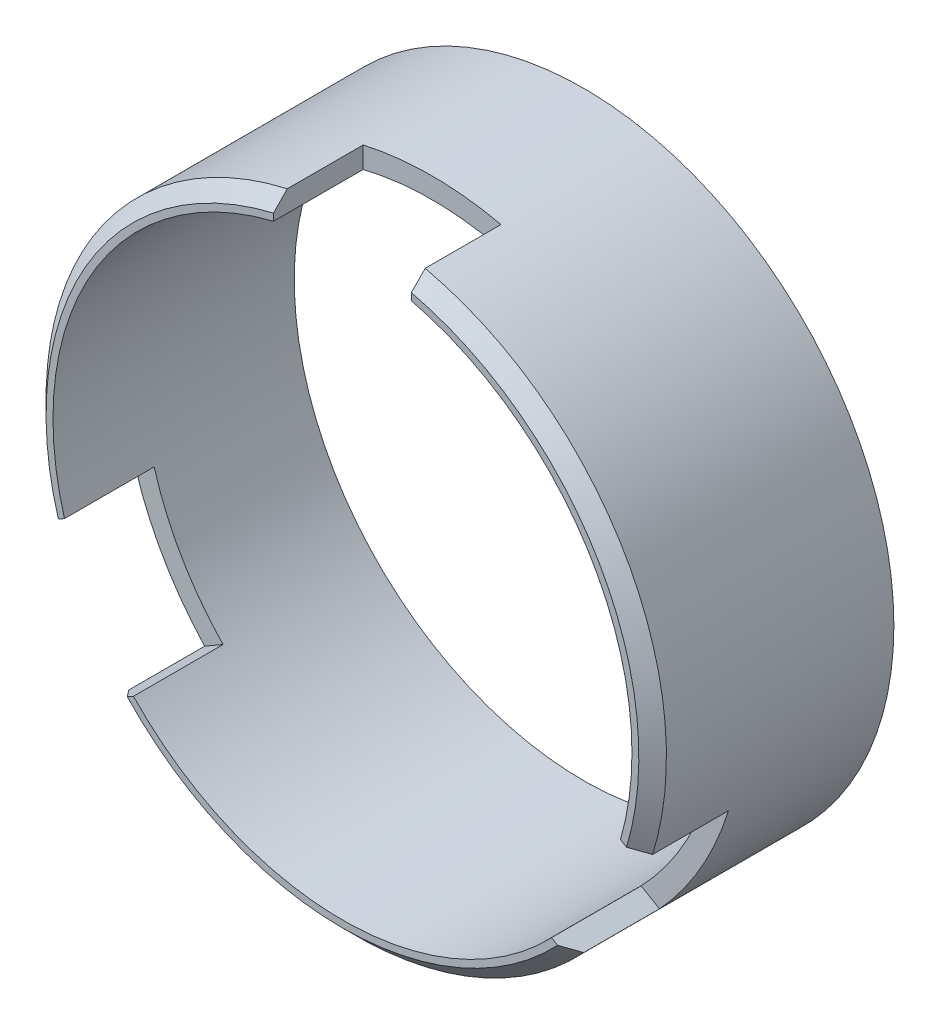
ISO-10303-21;
HEADER;
FILE_DESCRIPTION(('STEP AP214'),'2;1');
FILE_NAME('part.step','',(''),(''),'','','');
FILE_SCHEMA(('AUTOMOTIVE_DESIGN { 1 0 10303 214 1 1 1 1 }'));
ENDSEC;
DATA;
#1=APPLICATION_CONTEXT('core data for automotive mechanical design processes');
#2=APPLICATION_PROTOCOL_DEFINITION('international standard','automotive_design',2000,#1);
#3=PRODUCT_CONTEXT('',#1,'mechanical');
#4=PRODUCT('Part','Part','',(#3));
#5=PRODUCT_RELATED_PRODUCT_CATEGORY('part','',(#4));
#6=PRODUCT_DEFINITION_FORMATION('','',#4);
#7=PRODUCT_DEFINITION_CONTEXT('part definition',#1,'design');
#8=PRODUCT_DEFINITION('design','',#6,#7);
#9=PRODUCT_DEFINITION_SHAPE('','',#8);
#10=(LENGTH_UNIT() NAMED_UNIT(*) SI_UNIT(.MILLI.,.METRE.));
#11=(NAMED_UNIT(*) PLANE_ANGLE_UNIT() SI_UNIT($,.RADIAN.));
#12=(NAMED_UNIT(*) SI_UNIT($,.STERADIAN.) SOLID_ANGLE_UNIT());
#13=UNCERTAINTY_MEASURE_WITH_UNIT(LENGTH_MEASURE(1.E-05),#10,'distance_accuracy_value','');
#14=(GEOMETRIC_REPRESENTATION_CONTEXT(3) GLOBAL_UNCERTAINTY_ASSIGNED_CONTEXT((#13)) GLOBAL_UNIT_ASSIGNED_CONTEXT((#10,
#11,#12)) REPRESENTATION_CONTEXT('',''));
#15=CARTESIAN_POINT('',(0.,0.,0.));
#16=DIRECTION('',(0.,0.,1.));
#17=DIRECTION('',(1.,0.,0.));
#18=AXIS2_PLACEMENT_3D('',#15,#16,#17);
#19=CARTESIAN_POINT('',(0.,0.,17.5));
#20=DIRECTION('',(0.,0.,1.));
#21=DIRECTION('',(1.,0.,0.));
#22=AXIS2_PLACEMENT_3D('',#19,#20,#21);
#23=PLANE('',#22);
#24=DIRECTION('',(-0.866025403784444,0.499999999999992,0.));
#25=VECTOR('',#24,1.);
#26=CARTESIAN_POINT('',(23.2846096908266,-7.66987298107759,17.5));
#27=LINE('',#26,#25);
#28=CARTESIAN_POINT('',(20.6090447014745,-6.12513481424086,17.5));
#29=VERTEX_POINT('',#28);
#30=CARTESIAN_POINT('',(20.1635217326558,-5.8679120082632,17.5));
#31=VERTEX_POINT('',#30);
#32=EDGE_CURVE('E141',#29,#31,#27,.T.);
#33=ORIENTED_EDGE('',*,*,#32,.F.);
#34=CARTESIAN_POINT('',(0.,0.,17.5));
#35=DIRECTION('',(0.,0.,1.));
#36=DIRECTION('',(1.,0.,0.));
#37=AXIS2_PLACEMENT_3D('',#34,#35,#36);
#38=CIRCLE('',#37,21.5);
#39=CARTESIAN_POINT('',(4.99999999999999,20.9105236663265,17.5));
#40=VERTEX_POINT('',#39);
#41=EDGE_CURVE('E153',#29,#40,#38,.T.);
#42=ORIENTED_EDGE('',*,*,#41,.T.);
#43=DIRECTION('',(0.,1.,0.));
#44=VECTOR('',#43,1.);
#45=CARTESIAN_POINT('',(5.,19.,17.5));
#46=LINE('',#45,#44);
#47=CARTESIAN_POINT('',(5.,20.3960780543711,17.5));
#48=VERTEX_POINT('',#47);
#49=EDGE_CURVE('E338',#48,#40,#46,.T.);
#50=ORIENTED_EDGE('',*,*,#49,.F.);
#51=CARTESIAN_POINT('',(0.,0.,17.5));
#52=DIRECTION('',(0.,0.,1.));
#53=DIRECTION('',(1.,0.,0.));
#54=AXIS2_PLACEMENT_3D('',#51,#52,#53);
#55=CIRCLE('',#54,21.);
#56=EDGE_CURVE('E155',#31,#48,#55,.T.);
#57=ORIENTED_EDGE('',*,*,#56,.F.);
#58=EDGE_LOOP('',(#33,#42,#50,#57));
#59=FACE_BOUND('',#58,.T.);
#60=ADVANCED_FACE('F32',(#59),#23,.T.);
#61=CARTESIAN_POINT('',(0.,0.,17.5));
#62=DIRECTION('',(0.,0.,-1.));
#63=DIRECTION('',(-1.,0.,0.));
#64=AXIS2_PLACEMENT_3D('',#61,#62,#63);
#65=CONICAL_SURFACE('',#64,21.5,0.785398163397453);
#66=CARTESIAN_POINT('',(21.49853283888,-6.63868102981291,16.4998));
#67=CARTESIAN_POINT('',(21.3503445619276,-6.55312448822371,16.6666393707182));
#68=CARTESIAN_POINT('',(21.2021115715085,-6.46754213130241,16.8334257225624));
#69=CARTESIAN_POINT('',(20.90555616309,-6.29632578642235,17.1668923892295));
#70=CARTESIAN_POINT('',(20.7572337450903,-6.21069179846336,17.333572704052));
#71=CARTESIAN_POINT('',(20.6088666136233,-6.12503199517205,17.5002));
#72=B_SPLINE_CURVE_WITH_KNOTS('',3,(#66,#67,#68,#69,#70,#71),.UNSPECIFIED.,.F.,.F.,(4,2,4),(0.,
0.716962633500956,1.43392527012817),.UNSPECIFIED.);
#73=CARTESIAN_POINT('',(21.4983551919634,-6.63857846531777,16.5));
#74=VERTEX_POINT('',#73);
#75=EDGE_CURVE('E138',#74,#29,#72,.T.);
#76=ORIENTED_EDGE('',*,*,#75,.F.);
#77=CARTESIAN_POINT('',(0.,0.,16.5));
#78=DIRECTION('',(0.,0.,1.));
#79=DIRECTION('',(1.,0.,0.));
#80=AXIS2_PLACEMENT_3D('',#77,#78,#79);
#81=CIRCLE('',#80,22.5);
#82=CARTESIAN_POINT('',(5.,21.9374109684803,16.5));
#83=VERTEX_POINT('',#82);
#84=EDGE_CURVE('E176',#83,#74,#81,.F.);
#85=ORIENTED_EDGE('',*,*,#84,.F.);
#86=CARTESIAN_POINT('',(5.,18.689927542309,19.6528195455575));
#87=CARTESIAN_POINT('',(5.,19.1262544425193,19.2313016483825));
#88=CARTESIAN_POINT('',(5.,19.5621023441607,18.8092885722075));
#89=CARTESIAN_POINT('',(5.,20.4329823453068,17.9644237061282));
#90=CARTESIAN_POINT('',(5.,20.8680144469662,17.5415719184455));
#91=CARTESIAN_POINT('',(5.,21.7374069761219,16.6951794059946));
#92=CARTESIAN_POINT('',(5.,22.1717674041952,16.2716386818191));
#93=CARTESIAN_POINT('',(5.,23.0399184260285,15.4239712929834));
#94=CARTESIAN_POINT('',(5.,23.4737090182828,14.9998446267811));
#95=CARTESIAN_POINT('',(4.99999999999999,23.9072642802101,14.5754777863761));
#96=B_SPLINE_CURVE_WITH_KNOTS('',3,(#86,#87,#88,#89,#90,#91,#92,#93,#94,#95),.UNSPECIFIED.,.F.,
.F.,(4,2,2,2,4),(0.,1.82003371903964,3.64006262398424,5.46008996415568,7.28012210327091),.UNSPECIFIED.);
#97=EDGE_CURVE('E160',#40,#83,#96,.T.);
#98=ORIENTED_EDGE('',*,*,#97,.F.);
#99=ORIENTED_EDGE('',*,*,#41,.F.);
#100=EDGE_LOOP('',(#76,#85,#98,#99));
#101=FACE_BOUND('',#100,.T.);
#102=ADVANCED_FACE('F159',(#101),#65,.T.);
#103=DIRECTION('',(0.866025403784444,-0.499999999999992,0.));
#104=VECTOR('',#103,1.);
#105=CARTESIAN_POINT('',(13.9544826719044,-13.8301270189221,17.5));
#106=LINE('',#105,#104);
#107=CARTESIAN_POINT('',(15.1635217326558,-14.5281660461076,17.5));
#108=VERTEX_POINT('',#107);
#109=CARTESIAN_POINT('',(15.6090447014746,-14.7853888520853,17.5));
#110=VERTEX_POINT('',#109);
#111=EDGE_CURVE('E156',#108,#110,#106,.T.);
#112=ORIENTED_EDGE('',*,*,#111,.F.);
#113=CARTESIAN_POINT('',(-15.1635217326556,-14.5281660461078,17.5));
#114=VERTEX_POINT('',#113);
#115=EDGE_CURVE('E247',#114,#108,#55,.T.);
#116=ORIENTED_EDGE('',*,*,#115,.F.);
#117=DIRECTION('',(0.866025403784436,0.500000000000004,0.));
#118=VECTOR('',#117,1.);
#119=CARTESIAN_POINT('',(-18.2846096908264,-16.3301270189223,17.5));
#120=LINE('',#119,#118);
#121=CARTESIAN_POINT('',(-15.6090447014744,-14.7853888520855,17.5));
#122=VERTEX_POINT('',#121);
#123=EDGE_CURVE('E148',#122,#114,#120,.T.);
#124=ORIENTED_EDGE('',*,*,#123,.F.);
#125=EDGE_CURVE('E161',#122,#110,#38,.T.);
#126=ORIENTED_EDGE('',*,*,#125,.T.);
#127=EDGE_LOOP('',(#112,#116,#124,#126));
#128=FACE_BOUND('',#127,.T.);
#129=ADVANCED_FACE('F256',(#128),#23,.T.);
#130=CARTESIAN_POINT('',(15.6088666136234,-14.7852860330165,17.5002));
#131=CARTESIAN_POINT('',(15.7572337450903,-14.8709458363078,17.333572704052));
#132=CARTESIAN_POINT('',(15.90555616309,-14.9565798242668,17.1668923892295));
#133=CARTESIAN_POINT('',(16.2021115715085,-15.1277961691468,16.8334257225624));
#134=CARTESIAN_POINT('',(16.3503445619277,-15.2133785260681,16.6666393707182));
#135=CARTESIAN_POINT('',(16.4985328388801,-15.2989350676573,16.4998));
#136=B_SPLINE_CURVE_WITH_KNOTS('',3,(#130,#131,#132,#133,#134,#135),.UNSPECIFIED.,.F.,.F.,(4,2,
4),(0.,0.71696263662721,1.43392527012816),.UNSPECIFIED.);
#137=CARTESIAN_POINT('',(16.4983551919635,-15.2988325031622,16.5));
#138=VERTEX_POINT('',#137);
#139=EDGE_CURVE('E269',#110,#138,#136,.T.);
#140=ORIENTED_EDGE('',*,*,#139,.F.);
#141=ORIENTED_EDGE('',*,*,#125,.F.);
#142=CARTESIAN_POINT('',(-16.4985328388799,-15.2989350676576,16.4998));
#143=CARTESIAN_POINT('',(-16.3503445619275,-15.2133785260684,16.6666393707182));
#144=CARTESIAN_POINT('',(-16.2021115715083,-15.1277961691471,16.8334257225624));
#145=CARTESIAN_POINT('',(-15.9055561630898,-14.956579824267,17.1668923892295));
#146=CARTESIAN_POINT('',(-15.7572337450901,-14.870945836308,17.333572704052));
#147=CARTESIAN_POINT('',(-15.6088666136232,-14.7852860330167,17.5002));
#148=B_SPLINE_CURVE_WITH_KNOTS('',3,(#142,#143,#144,#145,#146,#147),.UNSPECIFIED.,.F.,.F.,(4,2,
4),(0.,0.716962633500951,1.43392527012815),.UNSPECIFIED.);
#149=CARTESIAN_POINT('',(-16.4983551919633,-15.2988325031624,16.5));
#150=VERTEX_POINT('',#149);
#151=EDGE_CURVE('E230',#150,#122,#148,.T.);
#152=ORIENTED_EDGE('',*,*,#151,.F.);
#153=EDGE_CURVE('E175',#138,#150,#81,.F.);
#154=ORIENTED_EDGE('',*,*,#153,.F.);
#155=EDGE_LOOP('',(#140,#141,#152,#154));
#156=FACE_BOUND('',#155,.T.);
#157=ADVANCED_FACE('F294',(#156),#65,.T.);
#158=CARTESIAN_POINT('',(0.,0.,17.5));
#159=DIRECTION('',(0.,0.,-1.));
#160=DIRECTION('',(-1.,0.,0.));
#161=AXIS2_PLACEMENT_3D('',#158,#159,#160);
#162=CYLINDRICAL_SURFACE('',#161,22.5);
#163=ORIENTED_EDGE('',*,*,#84,.T.);
#164=DIRECTION('',(0.,0.,-1.));
#165=VECTOR('',#164,1.);
#166=CARTESIAN_POINT('',(21.4983551919634,-6.63857846531777,17.5));
#167=LINE('',#166,#165);
#168=CARTESIAN_POINT('',(21.4983551919634,-6.63857846531777,11.));
#169=VERTEX_POINT('',#168);
#170=EDGE_CURVE('E143',#74,#169,#167,.T.);
#171=ORIENTED_EDGE('',*,*,#170,.T.);
#172=CARTESIAN_POINT('',(0.,0.,11.));
#173=DIRECTION('',(0.,0.,-1.));
#174=DIRECTION('',(-1.,0.,0.));
#175=AXIS2_PLACEMENT_3D('',#172,#173,#174);
#176=CIRCLE('',#175,22.5);
#177=CARTESIAN_POINT('',(16.4983551919635,-15.2988325031622,11.));
#178=VERTEX_POINT('',#177);
#179=EDGE_CURVE('E263',#169,#178,#176,.T.);
#180=ORIENTED_EDGE('',*,*,#179,.T.);
#181=DIRECTION('',(0.,0.,-1.));
#182=VECTOR('',#181,1.);
#183=CARTESIAN_POINT('',(16.4983551919635,-15.2988325031622,17.5));
#184=LINE('',#183,#182);
#185=EDGE_CURVE('E266',#178,#138,#184,.F.);
#186=ORIENTED_EDGE('',*,*,#185,.T.);
#187=ORIENTED_EDGE('',*,*,#153,.T.);
#188=DIRECTION('',(0.,0.,-1.));
#189=VECTOR('',#188,1.);
#190=CARTESIAN_POINT('',(-16.4983551919633,-15.2988325031624,17.5));
#191=LINE('',#190,#189);
#192=CARTESIAN_POINT('',(-16.4983551919633,-15.2988325031624,11.));
#193=VERTEX_POINT('',#192);
#194=EDGE_CURVE('E326',#150,#193,#191,.T.);
#195=ORIENTED_EDGE('',*,*,#194,.T.);
#196=CARTESIAN_POINT('',(0.,0.,11.));
#197=DIRECTION('',(0.,0.,-1.));
#198=DIRECTION('',(-1.,0.,0.));
#199=AXIS2_PLACEMENT_3D('',#196,#197,#198);
#200=CIRCLE('',#199,22.5);
#201=CARTESIAN_POINT('',(-21.4983551919633,-6.63857846531806,11.));
#202=VERTEX_POINT('',#201);
#203=EDGE_CURVE('E321',#193,#202,#200,.T.);
#204=ORIENTED_EDGE('',*,*,#203,.T.);
#205=DIRECTION('',(0.,0.,-1.));
#206=VECTOR('',#205,1.);
#207=CARTESIAN_POINT('',(-21.4983551919633,-6.63857846531806,17.5));
#208=LINE('',#207,#206);
#209=CARTESIAN_POINT('',(-21.4983551919633,-6.63857846531806,16.5));
#210=VERTEX_POINT('',#209);
#211=EDGE_CURVE('E316',#202,#210,#208,.F.);
#212=ORIENTED_EDGE('',*,*,#211,.T.);
#213=CARTESIAN_POINT('',(-5.00000000000002,21.9374109684803,16.5));
#214=VERTEX_POINT('',#213);
#215=EDGE_CURVE('E171',#210,#214,#81,.F.);
#216=ORIENTED_EDGE('',*,*,#215,.T.);
#217=DIRECTION('',(0.,0.,-1.));
#218=VECTOR('',#217,1.);
#219=CARTESIAN_POINT('',(-5.,21.9374109684803,17.5));
#220=LINE('',#219,#218);
#221=CARTESIAN_POINT('',(-5.00000000000001,21.9374109684803,11.));
#222=VERTEX_POINT('',#221);
#223=EDGE_CURVE('E351',#214,#222,#220,.T.);
#224=ORIENTED_EDGE('',*,*,#223,.T.);
#225=CARTESIAN_POINT('',(0.,0.,11.));
#226=DIRECTION('',(0.,0.,-1.));
#227=DIRECTION('',(-1.,0.,0.));
#228=AXIS2_PLACEMENT_3D('',#225,#226,#227);
#229=CIRCLE('',#228,22.5);
#230=CARTESIAN_POINT('',(5.,21.9374109684803,11.));
#231=VERTEX_POINT('',#230);
#232=EDGE_CURVE('E356',#222,#231,#229,.T.);
#233=ORIENTED_EDGE('',*,*,#232,.T.);
#234=DIRECTION('',(0.,0.,-1.));
#235=VECTOR('',#234,1.);
#236=CARTESIAN_POINT('',(4.99999999999999,21.9374109684803,17.5));
#237=LINE('',#236,#235);
#238=EDGE_CURVE('E346',#231,#83,#237,.F.);
#239=ORIENTED_EDGE('',*,*,#238,.T.);
#240=EDGE_LOOP('',(#163,#171,#180,#186,#187,#195,#204,#212,#216,#224,#233,#239));
#241=FACE_BOUND('',#240,.T.);
#242=CARTESIAN_POINT('',(0.,0.,0.));
#243=DIRECTION('',(0.,0.,1.));
#244=DIRECTION('',(1.,0.,0.));
#245=AXIS2_PLACEMENT_3D('',#242,#243,#244);
#246=CIRCLE('',#245,22.5);
#247=CARTESIAN_POINT('',(22.5,0.,0.));
#248=VERTEX_POINT('',#247);
#249=EDGE_CURVE('E162',#248,#248,#246,.T.);
#250=ORIENTED_EDGE('',*,*,#249,.T.);
#251=EDGE_LOOP('',(#250));
#252=FACE_BOUND('',#251,.T.);
#253=ADVANCED_FACE('F34',(#241,#252),#162,.T.);
#254=DIRECTION('',(-0.866025403784436,-0.500000000000004,0.));
#255=VECTOR('',#254,1.);
#256=CARTESIAN_POINT('',(-18.9544826719043,-5.1698729810779,17.5));
#257=LINE('',#256,#255);
#258=CARTESIAN_POINT('',(-20.1635217326557,-5.86791200826349,17.5));
#259=VERTEX_POINT('',#258);
#260=CARTESIAN_POINT('',(-20.6090447014744,-6.12513481424115,17.5));
#261=VERTEX_POINT('',#260);
#262=EDGE_CURVE('E55',#259,#261,#257,.T.);
#263=ORIENTED_EDGE('',*,*,#262,.F.);
#264=CARTESIAN_POINT('',(-5.,20.3960780543711,17.5));
#265=VERTEX_POINT('',#264);
#266=EDGE_CURVE('E359',#265,#259,#55,.T.);
#267=ORIENTED_EDGE('',*,*,#266,.F.);
#268=DIRECTION('',(0.,-1.,0.));
#269=VECTOR('',#268,1.);
#270=CARTESIAN_POINT('',(-5.00000000000002,24.,17.5));
#271=LINE('',#270,#269);
#272=CARTESIAN_POINT('',(-5.00000000000001,20.9105236663265,17.5));
#273=VERTEX_POINT('',#272);
#274=EDGE_CURVE('E336',#273,#265,#271,.T.);
#275=ORIENTED_EDGE('',*,*,#274,.F.);
#276=EDGE_CURVE('E164',#273,#261,#38,.T.);
#277=ORIENTED_EDGE('',*,*,#276,.T.);
#278=EDGE_LOOP('',(#263,#267,#275,#277));
#279=FACE_BOUND('',#278,.T.);
#280=ADVANCED_FACE('F290',(#279),#23,.T.);
#281=CARTESIAN_POINT('',(0.,0.,0.));
#282=DIRECTION('',(0.,0.,1.));
#283=DIRECTION('',(1.,0.,0.));
#284=AXIS2_PLACEMENT_3D('',#281,#282,#283);
#285=PLANE('',#284);
#286=CARTESIAN_POINT('',(0.,0.,0.));
#287=DIRECTION('',(0.,0.,1.));
#288=DIRECTION('',(1.,0.,0.));
#289=AXIS2_PLACEMENT_3D('',#286,#287,#288);
#290=CIRCLE('',#289,21.);
#291=CARTESIAN_POINT('',(21.,0.,0.));
#292=VERTEX_POINT('',#291);
#293=EDGE_CURVE('E167',#292,#292,#290,.T.);
#294=ORIENTED_EDGE('',*,*,#293,.T.);
#295=EDGE_LOOP('',(#294));
#296=FACE_BOUND('',#295,.T.);
#297=ORIENTED_EDGE('',*,*,#249,.F.);
#298=EDGE_LOOP('',(#297));
#299=FACE_BOUND('',#298,.T.);
#300=ADVANCED_FACE('F298',(#296,#299),#285,.F.);
#301=CARTESIAN_POINT('',(0.,0.,0.));
#302=DIRECTION('',(0.,0.,1.));
#303=DIRECTION('',(1.,0.,0.));
#304=AXIS2_PLACEMENT_3D('',#301,#302,#303);
#305=CYLINDRICAL_SURFACE('',#304,21.);
#306=ORIENTED_EDGE('',*,*,#293,.F.);
#307=EDGE_LOOP('',(#306));
#308=FACE_BOUND('',#307,.T.);
#309=CARTESIAN_POINT('',(0.,0.,11.));
#310=DIRECTION('',(0.,0.,-1.));
#311=DIRECTION('',(-1.,0.,0.));
#312=AXIS2_PLACEMENT_3D('',#309,#310,#311);
#313=CIRCLE('',#312,21.);
#314=CARTESIAN_POINT('',(15.1635217326558,-14.5281660461076,11.));
#315=VERTEX_POINT('',#314);
#316=CARTESIAN_POINT('',(20.1635217326558,-5.8679120082632,11.));
#317=VERTEX_POINT('',#316);
#318=EDGE_CURVE('E239',#315,#317,#313,.F.);
#319=ORIENTED_EDGE('',*,*,#318,.T.);
#320=DIRECTION('',(0.,0.,1.));
#321=VECTOR('',#320,1.);
#322=CARTESIAN_POINT('',(20.1635217326558,-5.86791200826319,0.));
#323=LINE('',#322,#321);
#324=EDGE_CURVE('E11',#317,#31,#323,.T.);
#325=ORIENTED_EDGE('',*,*,#324,.T.);
#326=ORIENTED_EDGE('',*,*,#56,.T.);
#327=DIRECTION('',(0.,0.,1.));
#328=VECTOR('',#327,1.);
#329=CARTESIAN_POINT('',(5.,20.3960780543711,0.));
#330=LINE('',#329,#328);
#331=CARTESIAN_POINT('',(5.,20.3960780543711,11.));
#332=VERTEX_POINT('',#331);
#333=EDGE_CURVE('E348',#48,#332,#330,.F.);
#334=ORIENTED_EDGE('',*,*,#333,.T.);
#335=CARTESIAN_POINT('',(0.,0.,11.));
#336=DIRECTION('',(0.,0.,-1.));
#337=DIRECTION('',(-1.,0.,0.));
#338=AXIS2_PLACEMENT_3D('',#335,#336,#337);
#339=CIRCLE('',#338,21.);
#340=CARTESIAN_POINT('',(-5.,20.3960780543711,11.));
#341=VERTEX_POINT('',#340);
#342=EDGE_CURVE('E186',#332,#341,#339,.F.);
#343=ORIENTED_EDGE('',*,*,#342,.T.);
#344=DIRECTION('',(0.,0.,1.));
#345=VECTOR('',#344,1.);
#346=CARTESIAN_POINT('',(-5.,20.3960780543711,0.));
#347=LINE('',#346,#345);
#348=EDGE_CURVE('E353',#341,#265,#347,.T.);
#349=ORIENTED_EDGE('',*,*,#348,.T.);
#350=ORIENTED_EDGE('',*,*,#266,.T.);
#351=DIRECTION('',(0.,0.,1.));
#352=VECTOR('',#351,1.);
#353=CARTESIAN_POINT('',(-20.1635217326557,-5.86791200826347,0.));
#354=LINE('',#353,#352);
#355=CARTESIAN_POINT('',(-20.1635217326557,-5.86791200826347,11.));
#356=VERTEX_POINT('',#355);
#357=EDGE_CURVE('E322',#259,#356,#354,.F.);
#358=ORIENTED_EDGE('',*,*,#357,.T.);
#359=CARTESIAN_POINT('',(0.,0.,11.));
#360=DIRECTION('',(0.,0.,-1.));
#361=DIRECTION('',(-1.,0.,0.));
#362=AXIS2_PLACEMENT_3D('',#359,#360,#361);
#363=CIRCLE('',#362,21.);
#364=CARTESIAN_POINT('',(-15.1635217326556,-14.5281660461078,11.));
#365=VERTEX_POINT('',#364);
#366=EDGE_CURVE('E236',#356,#365,#363,.F.);
#367=ORIENTED_EDGE('',*,*,#366,.T.);
#368=DIRECTION('',(0.,0.,1.));
#369=VECTOR('',#368,1.);
#370=CARTESIAN_POINT('',(-15.1635217326556,-14.5281660461078,0.));
#371=LINE('',#370,#369);
#372=EDGE_CURVE('E333',#365,#114,#371,.T.);
#373=ORIENTED_EDGE('',*,*,#372,.T.);
#374=ORIENTED_EDGE('',*,*,#115,.T.);
#375=DIRECTION('',(0.,0.,1.));
#376=VECTOR('',#375,1.);
#377=CARTESIAN_POINT('',(15.1635217326558,-14.5281660461076,0.));
#378=LINE('',#377,#376);
#379=EDGE_CURVE('E40',#108,#315,#378,.F.);
#380=ORIENTED_EDGE('',*,*,#379,.T.);
#381=EDGE_LOOP('',(#319,#325,#326,#334,#343,#349,#350,#358,#367,#373,#374,#380));
#382=FACE_BOUND('',#381,.T.);
#383=ADVANCED_FACE('F244',(#308,#382),#305,.F.);
#384=CARTESIAN_POINT('',(-20.6088666136232,-6.12503199517234,17.5002));
#385=CARTESIAN_POINT('',(-20.7572337450902,-6.21069179846365,17.333572704052));
#386=CARTESIAN_POINT('',(-20.9055561630899,-6.29632578642264,17.1668923892295));
#387=CARTESIAN_POINT('',(-21.2021115715084,-6.4675421313027,16.8334257225624));
#388=CARTESIAN_POINT('',(-21.3503445619276,-6.55312448822399,16.6666393707182));
#389=CARTESIAN_POINT('',(-21.4985328388799,-6.6386810298132,16.4998));
#390=B_SPLINE_CURVE_WITH_KNOTS('',3,(#384,#385,#386,#387,#388,#389),.UNSPECIFIED.,.F.,.F.,(4,2,
4),(0.,0.716962636627207,1.43392527012816),.UNSPECIFIED.);
#391=EDGE_CURVE('E224',#261,#210,#390,.T.);
#392=ORIENTED_EDGE('',*,*,#391,.F.);
#393=ORIENTED_EDGE('',*,*,#276,.F.);
#394=CARTESIAN_POINT('',(-5.00000000000001,23.9072642802101,14.5754777863761));
#395=CARTESIAN_POINT('',(-5.00000000000001,23.4737090182828,14.9998446267811));
#396=CARTESIAN_POINT('',(-5.00000000000001,23.0399184260285,15.4239712929834));
#397=CARTESIAN_POINT('',(-5.00000000000001,22.1717674041952,16.2716386818191));
#398=CARTESIAN_POINT('',(-5.,21.7374069761219,16.6951794059946));
#399=CARTESIAN_POINT('',(-5.,20.8680144469662,17.5415719184455));
#400=CARTESIAN_POINT('',(-5.00000000000001,20.4329823453068,17.9644237061282));
#401=CARTESIAN_POINT('',(-5.00000000000001,19.5621023441607,18.8092885722074));
#402=CARTESIAN_POINT('',(-5.00000000000001,19.1262544425193,19.2313016483825));
#403=CARTESIAN_POINT('',(-5.,18.689927542309,19.6528195455575));
#404=B_SPLINE_CURVE_WITH_KNOTS('',3,(#394,#395,#396,#397,#398,#399,#400,#401,#402,#403),
.UNSPECIFIED.,.F.,.F.,(4,2,2,2,4),(0.,1.82003213911522,3.64005947928666,5.46008838423126,
7.28012210327091),.UNSPECIFIED.);
#405=EDGE_CURVE('E184',#214,#273,#404,.T.);
#406=ORIENTED_EDGE('',*,*,#405,.F.);
#407=ORIENTED_EDGE('',*,*,#215,.F.);
#408=EDGE_LOOP('',(#392,#393,#406,#407));
#409=FACE_BOUND('',#408,.T.);
#410=ADVANCED_FACE('F200',(#409),#65,.T.);
#411=CARTESIAN_POINT('',(-5.00000000000001,19.,11.));
#412=DIRECTION('',(0.,0.,-1.));
#413=DIRECTION('',(-1.,0.,0.));
#414=AXIS2_PLACEMENT_3D('',#411,#412,#413);
#415=PLANE('',#414);
#416=DIRECTION('',(0.,-1.,0.));
#417=VECTOR('',#416,1.);
#418=CARTESIAN_POINT('',(-5.00000000000001,24.,11.));
#419=LINE('',#418,#417);
#420=EDGE_CURVE('E340',#222,#341,#419,.T.);
#421=ORIENTED_EDGE('',*,*,#420,.T.);
#422=ORIENTED_EDGE('',*,*,#342,.F.);
#423=DIRECTION('',(0.,1.,0.));
#424=VECTOR('',#423,1.);
#425=CARTESIAN_POINT('',(5.,19.,11.));
#426=LINE('',#425,#424);
#427=EDGE_CURVE('E343',#332,#231,#426,.T.);
#428=ORIENTED_EDGE('',*,*,#427,.T.);
#429=ORIENTED_EDGE('',*,*,#232,.F.);
#430=EDGE_LOOP('',(#421,#422,#428,#429));
#431=FACE_BOUND('',#430,.T.);
#432=ADVANCED_FACE('F211',(#431),#415,.F.);
#433=CARTESIAN_POINT('',(-5.00000000000001,24.,11.));
#434=DIRECTION('',(-1.,0.,0.));
#435=DIRECTION('',(0.,0.,1.));
#436=AXIS2_PLACEMENT_3D('',#433,#434,#435);
#437=PLANE('',#436);
#438=ORIENTED_EDGE('',*,*,#420,.F.);
#439=ORIENTED_EDGE('',*,*,#223,.F.);
#440=ORIENTED_EDGE('',*,*,#405,.T.);
#441=ORIENTED_EDGE('',*,*,#274,.T.);
#442=ORIENTED_EDGE('',*,*,#348,.F.);
#443=EDGE_LOOP('',(#438,#439,#440,#441,#442));
#444=FACE_BOUND('',#443,.T.);
#445=ADVANCED_FACE('F207',(#444),#437,.F.);
#446=CARTESIAN_POINT('',(5.,19.,11.));
#447=DIRECTION('',(1.,0.,0.));
#448=DIRECTION('',(0.,0.,-1.));
#449=AXIS2_PLACEMENT_3D('',#446,#447,#448);
#450=PLANE('',#449);
#451=ORIENTED_EDGE('',*,*,#49,.T.);
#452=ORIENTED_EDGE('',*,*,#97,.T.);
#453=ORIENTED_EDGE('',*,*,#238,.F.);
#454=ORIENTED_EDGE('',*,*,#427,.F.);
#455=ORIENTED_EDGE('',*,*,#333,.F.);
#456=EDGE_LOOP('',(#451,#452,#453,#454,#455));
#457=FACE_BOUND('',#456,.T.);
#458=ADVANCED_FACE('F203',(#457),#450,.F.);
#459=CARTESIAN_POINT('',(-13.9544826719043,-13.8301270189222,11.));
#460=DIRECTION('',(0.,0.,-1.));
#461=DIRECTION('',(-1.,0.,0.));
#462=AXIS2_PLACEMENT_3D('',#459,#460,#461);
#463=PLANE('',#462);
#464=DIRECTION('',(0.866025403784436,0.500000000000004,0.));
#465=VECTOR('',#464,1.);
#466=CARTESIAN_POINT('',(-18.2846096908264,-16.3301270189223,11.));
#467=LINE('',#466,#465);
#468=EDGE_CURVE('E328',#193,#365,#467,.T.);
#469=ORIENTED_EDGE('',*,*,#468,.T.);
#470=ORIENTED_EDGE('',*,*,#366,.F.);
#471=DIRECTION('',(-0.866025403784436,-0.500000000000004,0.));
#472=VECTOR('',#471,1.);
#473=CARTESIAN_POINT('',(-18.9544826719043,-5.16987298107789,11.));
#474=LINE('',#473,#472);
#475=EDGE_CURVE('E323',#356,#202,#474,.T.);
#476=ORIENTED_EDGE('',*,*,#475,.T.);
#477=ORIENTED_EDGE('',*,*,#203,.F.);
#478=EDGE_LOOP('',(#469,#470,#476,#477));
#479=FACE_BOUND('',#478,.T.);
#480=ADVANCED_FACE('F206',(#479),#463,.F.);
#481=CARTESIAN_POINT('',(-18.2846096908264,-16.3301270189223,11.));
#482=DIRECTION('',(0.500000000000004,-0.866025403784436,0.));
#483=DIRECTION('',(0.866025403784437,0.500000000000004,0.));
#484=AXIS2_PLACEMENT_3D('',#481,#482,#483);
#485=PLANE('',#484);
#486=ORIENTED_EDGE('',*,*,#468,.F.);
#487=ORIENTED_EDGE('',*,*,#194,.F.);
#488=ORIENTED_EDGE('',*,*,#151,.T.);
#489=ORIENTED_EDGE('',*,*,#123,.T.);
#490=ORIENTED_EDGE('',*,*,#372,.F.);
#491=EDGE_LOOP('',(#486,#487,#488,#489,#490));
#492=FACE_BOUND('',#491,.T.);
#493=ADVANCED_FACE('F220',(#492),#485,.F.);
#494=CARTESIAN_POINT('',(-18.9544826719043,-5.16987298107789,11.));
#495=DIRECTION('',(-0.500000000000004,0.866025403784436,0.));
#496=DIRECTION('',(-0.866025403784437,-0.500000000000004,0.));
#497=AXIS2_PLACEMENT_3D('',#494,#495,#496);
#498=PLANE('',#497);
#499=ORIENTED_EDGE('',*,*,#262,.T.);
#500=ORIENTED_EDGE('',*,*,#391,.T.);
#501=ORIENTED_EDGE('',*,*,#211,.F.);
#502=ORIENTED_EDGE('',*,*,#475,.F.);
#503=ORIENTED_EDGE('',*,*,#357,.F.);
#504=EDGE_LOOP('',(#499,#500,#501,#502,#503));
#505=FACE_BOUND('',#504,.T.);
#506=ADVANCED_FACE('F216',(#505),#498,.F.);
#507=CARTESIAN_POINT('',(23.2846096908266,-7.66987298107759,11.));
#508=DIRECTION('',(0.499999999999992,0.866025403784443,0.));
#509=DIRECTION('',(-0.866025403784444,0.499999999999992,0.));
#510=AXIS2_PLACEMENT_3D('',#507,#508,#509);
#511=PLANE('',#510);
#512=ORIENTED_EDGE('',*,*,#75,.T.);
#513=ORIENTED_EDGE('',*,*,#32,.T.);
#514=ORIENTED_EDGE('',*,*,#324,.F.);
#515=DIRECTION('',(-0.866025403784444,0.499999999999992,0.));
#516=VECTOR('',#515,1.);
#517=CARTESIAN_POINT('',(23.2846096908266,-7.66987298107759,11.));
#518=LINE('',#517,#516);
#519=EDGE_CURVE('E47',#169,#317,#518,.T.);
#520=ORIENTED_EDGE('',*,*,#519,.F.);
#521=ORIENTED_EDGE('',*,*,#170,.F.);
#522=EDGE_LOOP('',(#512,#513,#514,#520,#521));
#523=FACE_BOUND('',#522,.T.);
#524=ADVANCED_FACE('F140',(#523),#511,.F.);
#525=CARTESIAN_POINT('',(13.9544826719044,-13.8301270189221,11.));
#526=DIRECTION('',(-0.499999999999992,-0.866025403784443,0.));
#527=DIRECTION('',(0.866025403784444,-0.499999999999992,0.));
#528=AXIS2_PLACEMENT_3D('',#525,#526,#527);
#529=PLANE('',#528);
#530=ORIENTED_EDGE('',*,*,#139,.T.);
#531=ORIENTED_EDGE('',*,*,#185,.F.);
#532=DIRECTION('',(0.866025403784444,-0.499999999999992,0.));
#533=VECTOR('',#532,1.);
#534=CARTESIAN_POINT('',(13.9544826719044,-13.8301270189221,11.));
#535=LINE('',#534,#533);
#536=EDGE_CURVE('E254',#315,#178,#535,.T.);
#537=ORIENTED_EDGE('',*,*,#536,.F.);
#538=ORIENTED_EDGE('',*,*,#379,.F.);
#539=ORIENTED_EDGE('',*,*,#111,.T.);
#540=EDGE_LOOP('',(#530,#531,#537,#538,#539));
#541=FACE_BOUND('',#540,.T.);
#542=ADVANCED_FACE('F251',(#541),#529,.F.);
#543=CARTESIAN_POINT('',(18.9544826719044,-5.16987298107762,11.));
#544=DIRECTION('',(0.,0.,-1.));
#545=DIRECTION('',(-1.,0.,0.));
#546=AXIS2_PLACEMENT_3D('',#543,#544,#545);
#547=PLANE('',#546);
#548=ORIENTED_EDGE('',*,*,#519,.T.);
#549=ORIENTED_EDGE('',*,*,#318,.F.);
#550=ORIENTED_EDGE('',*,*,#536,.T.);
#551=ORIENTED_EDGE('',*,*,#179,.F.);
#552=EDGE_LOOP('',(#548,#549,#550,#551));
#553=FACE_BOUND('',#552,.T.);
#554=ADVANCED_FACE('F279',(#553),#547,.F.);
#555=CLOSED_SHELL('',(#60,#102,#129,#157,#253,#280,#300,#383,#410,#432,#445,#458,#480,#493,#506,
#524,#542,#554));
#556=MANIFOLD_SOLID_BREP('B2',#555);
#557=ADVANCED_BREP_SHAPE_REPRESENTATION('',(#18,#556),#14);
#558=SHAPE_DEFINITION_REPRESENTATION(#9,#557);
ENDSEC;
END-ISO-10303-21;
